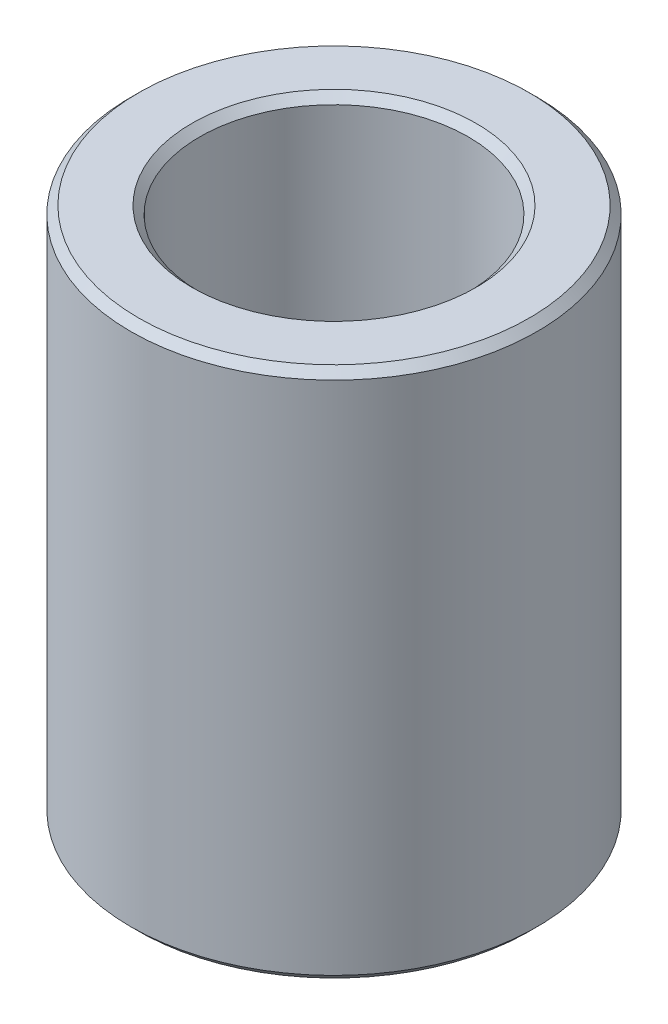
ISO-10303-21;
HEADER;
FILE_DESCRIPTION(('STEP AP214'),'2;1');
FILE_NAME('part.step','',(''),(''),'','','');
FILE_SCHEMA(('AUTOMOTIVE_DESIGN { 1 0 10303 214 1 1 1 1 }'));
ENDSEC;
DATA;
#1=APPLICATION_CONTEXT('core data for automotive mechanical design processes');
#2=APPLICATION_PROTOCOL_DEFINITION('international standard','automotive_design',2000,#1);
#3=PRODUCT_CONTEXT('',#1,'mechanical');
#4=PRODUCT('Part','Part','',(#3));
#5=PRODUCT_RELATED_PRODUCT_CATEGORY('part','',(#4));
#6=PRODUCT_DEFINITION_FORMATION('','',#4);
#7=PRODUCT_DEFINITION_CONTEXT('part definition',#1,'design');
#8=PRODUCT_DEFINITION('design','',#6,#7);
#9=PRODUCT_DEFINITION_SHAPE('','',#8);
#10=(LENGTH_UNIT() NAMED_UNIT(*) SI_UNIT(.MILLI.,.METRE.));
#11=(NAMED_UNIT(*) PLANE_ANGLE_UNIT() SI_UNIT($,.RADIAN.));
#12=(NAMED_UNIT(*) SI_UNIT($,.STERADIAN.) SOLID_ANGLE_UNIT());
#13=UNCERTAINTY_MEASURE_WITH_UNIT(LENGTH_MEASURE(1.E-05),#10,'distance_accuracy_value','');
#14=(GEOMETRIC_REPRESENTATION_CONTEXT(3) GLOBAL_UNCERTAINTY_ASSIGNED_CONTEXT((#13)) GLOBAL_UNIT_ASSIGNED_CONTEXT((#10,
#11,#12)) REPRESENTATION_CONTEXT('',''));
#15=CARTESIAN_POINT('',(0.,0.,0.));
#16=DIRECTION('',(0.,0.,1.));
#17=DIRECTION('',(1.,0.,0.));
#18=AXIS2_PLACEMENT_3D('',#15,#16,#17);
#19=CARTESIAN_POINT('',(0.,17.,0.));
#20=DIRECTION('',(0.,-1.,0.));
#21=DIRECTION('',(0.,0.,-1.));
#22=AXIS2_PLACEMENT_3D('',#19,#20,#21);
#23=CYLINDRICAL_SURFACE('',#22,6.5);
#24=CARTESIAN_POINT('',(0.,16.75,0.));
#25=DIRECTION('',(0.,-1.,0.));
#26=DIRECTION('',(0.,0.,-1.));
#27=AXIS2_PLACEMENT_3D('',#24,#25,#26);
#28=CIRCLE('',#27,6.5);
#29=CARTESIAN_POINT('',(0.,16.75,-6.5));
#30=VERTEX_POINT('',#29);
#31=EDGE_CURVE('E11',#30,#30,#28,.F.);
#32=ORIENTED_EDGE('',*,*,#31,.F.);
#33=EDGE_LOOP('',(#32));
#34=FACE_BOUND('',#33,.T.);
#35=CARTESIAN_POINT('',(0.,0.249999999999999,0.));
#36=DIRECTION('',(0.,1.,0.));
#37=DIRECTION('',(0.,0.,1.));
#38=AXIS2_PLACEMENT_3D('',#35,#36,#37);
#39=CIRCLE('',#38,6.5);
#40=CARTESIAN_POINT('',(0.,0.249999999999999,6.5));
#41=VERTEX_POINT('',#40);
#42=EDGE_CURVE('E66',#41,#41,#39,.F.);
#43=ORIENTED_EDGE('',*,*,#42,.F.);
#44=EDGE_LOOP('',(#43));
#45=FACE_BOUND('',#44,.T.);
#46=ADVANCED_FACE('F43',(#34,#45),#23,.T.);
#47=CARTESIAN_POINT('',(0.,17.,0.));
#48=DIRECTION('',(0.,-1.,0.));
#49=DIRECTION('',(0.,0.,-1.));
#50=AXIS2_PLACEMENT_3D('',#47,#48,#49);
#51=CYLINDRICAL_SURFACE('',#50,4.3);
#52=CARTESIAN_POINT('',(0.,0.249999999999999,0.));
#53=DIRECTION('',(0.,-1.,0.));
#54=DIRECTION('',(0.,0.,-1.));
#55=AXIS2_PLACEMENT_3D('',#52,#53,#54);
#56=CIRCLE('',#55,4.3);
#57=CARTESIAN_POINT('',(0.,0.249999999999999,-4.3));
#58=VERTEX_POINT('',#57);
#59=EDGE_CURVE('E46',#58,#58,#56,.F.);
#60=ORIENTED_EDGE('',*,*,#59,.F.);
#61=EDGE_LOOP('',(#60));
#62=FACE_BOUND('',#61,.T.);
#63=CARTESIAN_POINT('',(0.,16.75,0.));
#64=DIRECTION('',(0.,1.,0.));
#65=DIRECTION('',(0.,0.,1.));
#66=AXIS2_PLACEMENT_3D('',#63,#64,#65);
#67=CIRCLE('',#66,4.3);
#68=CARTESIAN_POINT('',(0.,16.75,4.3));
#69=VERTEX_POINT('',#68);
#70=EDGE_CURVE('E51',#69,#69,#67,.F.);
#71=ORIENTED_EDGE('',*,*,#70,.F.);
#72=EDGE_LOOP('',(#71));
#73=FACE_BOUND('',#72,.T.);
#74=ADVANCED_FACE('F88',(#62,#73),#51,.F.);
#75=CARTESIAN_POINT('',(0.,17.,0.));
#76=DIRECTION('',(0.,1.,0.));
#77=DIRECTION('',(0.,0.,1.));
#78=AXIS2_PLACEMENT_3D('',#75,#76,#77);
#79=CONICAL_SURFACE('',#78,4.55,0.78539816339745);
#80=ORIENTED_EDGE('',*,*,#70,.T.);
#81=EDGE_LOOP('',(#80));
#82=FACE_BOUND('',#81,.T.);
#83=CARTESIAN_POINT('',(0.,17.,0.));
#84=DIRECTION('',(0.,1.,0.));
#85=DIRECTION('',(0.,0.,1.));
#86=AXIS2_PLACEMENT_3D('',#83,#84,#85);
#87=CIRCLE('',#86,4.55);
#88=CARTESIAN_POINT('',(0.,17.,4.55));
#89=VERTEX_POINT('',#88);
#90=EDGE_CURVE('E56',#89,#89,#87,.T.);
#91=ORIENTED_EDGE('',*,*,#90,.T.);
#92=EDGE_LOOP('',(#91));
#93=FACE_BOUND('',#92,.T.);
#94=ADVANCED_FACE('F93',(#82,#93),#79,.F.);
#95=CARTESIAN_POINT('',(0.,17.,0.));
#96=DIRECTION('',(0.,-1.,0.));
#97=DIRECTION('',(0.,0.,1.));
#98=AXIS2_PLACEMENT_3D('',#95,#96,#97);
#99=CONICAL_SURFACE('',#98,6.25,0.78539816339745);
#100=CARTESIAN_POINT('',(0.,17.,0.));
#101=DIRECTION('',(0.,1.,0.));
#102=DIRECTION('',(0.,0.,1.));
#103=AXIS2_PLACEMENT_3D('',#100,#101,#102);
#104=CIRCLE('',#103,6.25);
#105=CARTESIAN_POINT('',(0.,17.,6.25));
#106=VERTEX_POINT('',#105);
#107=EDGE_CURVE('E62',#106,#106,#104,.T.);
#108=ORIENTED_EDGE('',*,*,#107,.F.);
#109=EDGE_LOOP('',(#108));
#110=FACE_BOUND('',#109,.T.);
#111=ORIENTED_EDGE('',*,*,#31,.T.);
#112=EDGE_LOOP('',(#111));
#113=FACE_BOUND('',#112,.T.);
#114=ADVANCED_FACE('F99',(#110,#113),#99,.T.);
#115=CARTESIAN_POINT('',(0.,17.,0.));
#116=DIRECTION('',(0.,1.,0.));
#117=DIRECTION('',(0.,0.,1.));
#118=AXIS2_PLACEMENT_3D('',#115,#116,#117);
#119=PLANE('',#118);
#120=ORIENTED_EDGE('',*,*,#90,.F.);
#121=EDGE_LOOP('',(#120));
#122=FACE_BOUND('',#121,.T.);
#123=ORIENTED_EDGE('',*,*,#107,.T.);
#124=EDGE_LOOP('',(#123));
#125=FACE_BOUND('',#124,.T.);
#126=ADVANCED_FACE('F106',(#122,#125),#119,.T.);
#127=CARTESIAN_POINT('',(0.,0.,0.));
#128=DIRECTION('',(0.,-1.,0.));
#129=DIRECTION('',(0.,0.,-1.));
#130=AXIS2_PLACEMENT_3D('',#127,#128,#129);
#131=CONICAL_SURFACE('',#130,4.55,0.78539816339745);
#132=ORIENTED_EDGE('',*,*,#59,.T.);
#133=EDGE_LOOP('',(#132));
#134=FACE_BOUND('',#133,.T.);
#135=CARTESIAN_POINT('',(0.,0.,0.));
#136=DIRECTION('',(0.,-1.,0.));
#137=DIRECTION('',(0.,0.,-1.));
#138=AXIS2_PLACEMENT_3D('',#135,#136,#137);
#139=CIRCLE('',#138,4.55);
#140=CARTESIAN_POINT('',(0.,0.,-4.55));
#141=VERTEX_POINT('',#140);
#142=EDGE_CURVE('E70',#141,#141,#139,.T.);
#143=ORIENTED_EDGE('',*,*,#142,.T.);
#144=EDGE_LOOP('',(#143));
#145=FACE_BOUND('',#144,.T.);
#146=ADVANCED_FACE('F108',(#134,#145),#131,.F.);
#147=CARTESIAN_POINT('',(0.,0.,0.));
#148=DIRECTION('',(0.,1.,0.));
#149=DIRECTION('',(0.,0.,1.));
#150=AXIS2_PLACEMENT_3D('',#147,#148,#149);
#151=PLANE('',#150);
#152=ORIENTED_EDGE('',*,*,#142,.F.);
#153=EDGE_LOOP('',(#152));
#154=FACE_BOUND('',#153,.T.);
#155=CARTESIAN_POINT('',(0.,0.,0.));
#156=DIRECTION('',(0.,-1.,0.));
#157=DIRECTION('',(0.,0.,-1.));
#158=AXIS2_PLACEMENT_3D('',#155,#156,#157);
#159=CIRCLE('',#158,6.25);
#160=CARTESIAN_POINT('',(0.,0.,-6.25));
#161=VERTEX_POINT('',#160);
#162=EDGE_CURVE('E74',#161,#161,#159,.T.);
#163=ORIENTED_EDGE('',*,*,#162,.T.);
#164=EDGE_LOOP('',(#163));
#165=FACE_BOUND('',#164,.T.);
#166=ADVANCED_FACE('F79',(#154,#165),#151,.F.);
#167=CARTESIAN_POINT('',(0.,0.,0.));
#168=DIRECTION('',(0.,1.,0.));
#169=DIRECTION('',(0.,0.,-1.));
#170=AXIS2_PLACEMENT_3D('',#167,#168,#169);
#171=CONICAL_SURFACE('',#170,6.25,0.78539816339745);
#172=ORIENTED_EDGE('',*,*,#162,.F.);
#173=EDGE_LOOP('',(#172));
#174=FACE_BOUND('',#173,.T.);
#175=ORIENTED_EDGE('',*,*,#42,.T.);
#176=EDGE_LOOP('',(#175));
#177=FACE_BOUND('',#176,.T.);
#178=ADVANCED_FACE('F81',(#174,#177),#171,.T.);
#179=CLOSED_SHELL('',(#46,#74,#94,#114,#126,#146,#166,#178));
#180=MANIFOLD_SOLID_BREP('B2',#179);
#181=ADVANCED_BREP_SHAPE_REPRESENTATION('',(#18,#180),#14);
#182=SHAPE_DEFINITION_REPRESENTATION(#9,#181);
ENDSEC;
END-ISO-10303-21;
